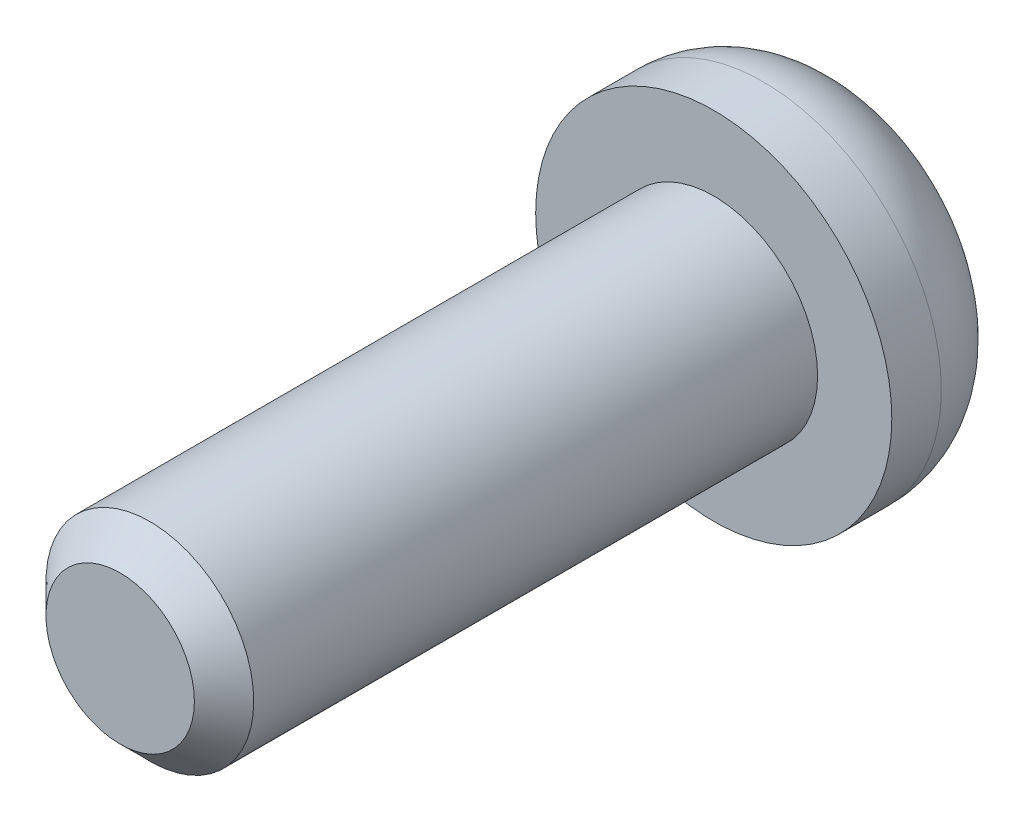
ISO-10303-21;
HEADER;
FILE_DESCRIPTION(('STEP AP214'),'2;1');
FILE_NAME('part.step','',(''),(''),'','','');
FILE_SCHEMA(('AUTOMOTIVE_DESIGN { 1 0 10303 214 1 1 1 1 }'));
ENDSEC;
DATA;
#1=APPLICATION_CONTEXT('core data for automotive mechanical design processes');
#2=APPLICATION_PROTOCOL_DEFINITION('international standard','automotive_design',2000,#1);
#3=PRODUCT_CONTEXT('',#1,'mechanical');
#4=PRODUCT('Part','Part','',(#3));
#5=PRODUCT_RELATED_PRODUCT_CATEGORY('part','',(#4));
#6=PRODUCT_DEFINITION_FORMATION('','',#4);
#7=PRODUCT_DEFINITION_CONTEXT('part definition',#1,'design');
#8=PRODUCT_DEFINITION('design','',#6,#7);
#9=PRODUCT_DEFINITION_SHAPE('','',#8);
#10=(LENGTH_UNIT() NAMED_UNIT(*) SI_UNIT(.MILLI.,.METRE.));
#11=(NAMED_UNIT(*) PLANE_ANGLE_UNIT() SI_UNIT($,.RADIAN.));
#12=(NAMED_UNIT(*) SI_UNIT($,.STERADIAN.) SOLID_ANGLE_UNIT());
#13=UNCERTAINTY_MEASURE_WITH_UNIT(LENGTH_MEASURE(1.E-05),#10,'distance_accuracy_value','');
#14=(GEOMETRIC_REPRESENTATION_CONTEXT(3) GLOBAL_UNCERTAINTY_ASSIGNED_CONTEXT((#13)) GLOBAL_UNIT_ASSIGNED_CONTEXT((#10,
#11,#12)) REPRESENTATION_CONTEXT('',''));
#15=CARTESIAN_POINT('',(0.,0.,0.));
#16=DIRECTION('',(0.,0.,1.));
#17=DIRECTION('',(1.,0.,0.));
#18=AXIS2_PLACEMENT_3D('',#15,#16,#17);
#19=CARTESIAN_POINT('',(0.,0.,0.));
#20=DIRECTION('',(0.,0.,1.));
#21=DIRECTION('',(1.,0.,0.));
#22=AXIS2_PLACEMENT_3D('',#19,#20,#21);
#23=PLANE('',#22);
#24=DIRECTION('',(0.,1.,0.));
#25=VECTOR('',#24,1.);
#26=CARTESIAN_POINT('',(-0.443511416600374,-0.411741974224887,0.));
#27=LINE('',#26,#25);
#28=CARTESIAN_POINT('',(-0.443511416600373,-0.783133209195683,0.));
#29=VERTEX_POINT('',#28);
#30=CARTESIAN_POINT('',(-0.443511416600374,-0.411741974224887,0.));
#31=VERTEX_POINT('',#30);
#32=EDGE_CURVE('E201',#29,#31,#27,.T.);
#33=ORIENTED_EDGE('',*,*,#32,.F.);
#34=CARTESIAN_POINT('',(0.,0.,0.));
#35=DIRECTION('',(0.,0.,1.));
#36=DIRECTION('',(1.,0.,0.));
#37=AXIS2_PLACEMENT_3D('',#34,#35,#36);
#38=CIRCLE('',#37,0.9);
#39=CARTESIAN_POINT('',(-0.800292788085331,-0.411741974224887,0.));
#40=VERTEX_POINT('',#39);
#41=EDGE_CURVE('E268',#29,#40,#38,.F.);
#42=ORIENTED_EDGE('',*,*,#41,.T.);
#43=DIRECTION('',(-1.,0.,0.));
#44=VECTOR('',#43,1.);
#45=CARTESIAN_POINT('',(-1.24419857549185,-0.411741974224887,0.));
#46=LINE('',#45,#44);
#47=EDGE_CURVE('E203',#31,#40,#46,.T.);
#48=ORIENTED_EDGE('',*,*,#47,.F.);
#49=EDGE_LOOP('',(#33,#42,#48));
#50=FACE_BOUND('',#49,.T.);
#51=ADVANCED_FACE('F35',(#50),#23,.F.);
#52=DIRECTION('',(1.,0.,0.));
#53=VECTOR('',#52,1.);
#54=CARTESIAN_POINT('',(-0.443511416600373,0.411741974224889,0.));
#55=LINE('',#54,#53);
#56=CARTESIAN_POINT('',(-0.800292788085329,0.411741974224889,0.));
#57=VERTEX_POINT('',#56);
#58=CARTESIAN_POINT('',(-0.443511416600373,0.411741974224889,0.));
#59=VERTEX_POINT('',#58);
#60=EDGE_CURVE('E207',#57,#59,#55,.T.);
#61=ORIENTED_EDGE('',*,*,#60,.F.);
#62=CARTESIAN_POINT('',(0.,0.,0.));
#63=DIRECTION('',(0.,0.,1.));
#64=DIRECTION('',(1.,0.,0.));
#65=AXIS2_PLACEMENT_3D('',#62,#63,#64);
#66=CIRCLE('',#65,0.9);
#67=CARTESIAN_POINT('',(-0.443511416600373,0.783133209195683,0.));
#68=VERTEX_POINT('',#67);
#69=EDGE_CURVE('E266',#57,#68,#66,.F.);
#70=ORIENTED_EDGE('',*,*,#69,.T.);
#71=DIRECTION('',(0.,1.,0.));
#72=VECTOR('',#71,1.);
#73=CARTESIAN_POINT('',(-0.443511416600373,0.411741974224889,0.));
#74=LINE('',#73,#72);
#75=EDGE_CURVE('E209',#59,#68,#74,.T.);
#76=ORIENTED_EDGE('',*,*,#75,.F.);
#77=EDGE_LOOP('',(#61,#70,#76));
#78=FACE_BOUND('',#77,.T.);
#79=ADVANCED_FACE('F390',(#78),#23,.F.);
#80=DIRECTION('',(0.,-1.,0.));
#81=VECTOR('',#80,1.);
#82=CARTESIAN_POINT('',(0.443511416600373,0.411741974224888,0.));
#83=LINE('',#82,#81);
#84=CARTESIAN_POINT('',(0.443511416600373,0.783133209195683,0.));
#85=VERTEX_POINT('',#84);
#86=CARTESIAN_POINT('',(0.443511416600373,0.411741974224888,0.));
#87=VERTEX_POINT('',#86);
#88=EDGE_CURVE('E212',#85,#87,#83,.T.);
#89=ORIENTED_EDGE('',*,*,#88,.F.);
#90=CARTESIAN_POINT('',(0.,0.,0.));
#91=DIRECTION('',(0.,0.,1.));
#92=DIRECTION('',(1.,0.,0.));
#93=AXIS2_PLACEMENT_3D('',#90,#91,#92);
#94=CIRCLE('',#93,0.9);
#95=CARTESIAN_POINT('',(0.80029278808533,0.411741974224888,0.));
#96=VERTEX_POINT('',#95);
#97=EDGE_CURVE('E264',#85,#96,#94,.F.);
#98=ORIENTED_EDGE('',*,*,#97,.T.);
#99=DIRECTION('',(1.,0.,0.));
#100=VECTOR('',#99,1.);
#101=CARTESIAN_POINT('',(0.443511416600373,0.411741974224888,0.));
#102=LINE('',#101,#100);
#103=EDGE_CURVE('E214',#87,#96,#102,.T.);
#104=ORIENTED_EDGE('',*,*,#103,.F.);
#105=EDGE_LOOP('',(#89,#98,#104));
#106=FACE_BOUND('',#105,.T.);
#107=ADVANCED_FACE('F413',(#106),#23,.F.);
#108=CARTESIAN_POINT('',(0.,0.,1.4));
#109=DIRECTION('',(0.,0.,1.));
#110=DIRECTION('',(1.,0.,0.));
#111=AXIS2_PLACEMENT_3D('',#108,#109,#110);
#112=PLANE('',#111);
#113=CARTESIAN_POINT('',(0.,0.,1.4));
#114=DIRECTION('',(0.,0.,1.));
#115=DIRECTION('',(1.,0.,0.));
#116=AXIS2_PLACEMENT_3D('',#113,#114,#115);
#117=CIRCLE('',#116,1.8);
#118=CARTESIAN_POINT('',(1.8,0.,1.4));
#119=VERTEX_POINT('',#118);
#120=EDGE_CURVE('E222',#119,#119,#117,.T.);
#121=ORIENTED_EDGE('',*,*,#120,.T.);
#122=EDGE_LOOP('',(#121));
#123=FACE_BOUND('',#122,.T.);
#124=CARTESIAN_POINT('',(0.,0.,1.4));
#125=DIRECTION('',(0.,0.,1.));
#126=DIRECTION('',(1.,0.,0.));
#127=AXIS2_PLACEMENT_3D('',#124,#125,#126);
#128=CIRCLE('',#127,1.05);
#129=CARTESIAN_POINT('',(1.05,0.,1.4));
#130=VERTEX_POINT('',#129);
#131=EDGE_CURVE('E204',#130,#130,#128,.T.);
#132=ORIENTED_EDGE('',*,*,#131,.F.);
#133=EDGE_LOOP('',(#132));
#134=FACE_BOUND('',#133,.T.);
#135=ADVANCED_FACE('F296',(#123,#134),#112,.T.);
#136=CARTESIAN_POINT('',(0.,0.,1.4));
#137=DIRECTION('',(0.,0.,-1.));
#138=DIRECTION('',(-1.,0.,0.));
#139=AXIS2_PLACEMENT_3D('',#136,#137,#138);
#140=CYLINDRICAL_SURFACE('',#139,1.8);
#141=CARTESIAN_POINT('',(0.,0.,0.9));
#142=DIRECTION('',(0.,0.,1.));
#143=DIRECTION('',(1.,0.,0.));
#144=AXIS2_PLACEMENT_3D('',#141,#142,#143);
#145=CIRCLE('',#144,1.8);
#146=CARTESIAN_POINT('',(1.8,0.,0.9));
#147=VERTEX_POINT('',#146);
#148=EDGE_CURVE('E259',#147,#147,#145,.T.);
#149=ORIENTED_EDGE('',*,*,#148,.T.);
#150=EDGE_LOOP('',(#149));
#151=FACE_BOUND('',#150,.T.);
#152=ORIENTED_EDGE('',*,*,#120,.F.);
#153=EDGE_LOOP('',(#152));
#154=FACE_BOUND('',#153,.T.);
#155=ADVANCED_FACE('F421',(#151,#154),#140,.T.);
#156=DIRECTION('',(-1.,0.,0.));
#157=VECTOR('',#156,1.);
#158=CARTESIAN_POINT('',(1.24419857549185,-0.411741974224888,0.));
#159=LINE('',#158,#157);
#160=CARTESIAN_POINT('',(0.80029278808533,-0.411741974224888,0.));
#161=VERTEX_POINT('',#160);
#162=CARTESIAN_POINT('',(0.443511416600374,-0.411741974224888,0.));
#163=VERTEX_POINT('',#162);
#164=EDGE_CURVE('E217',#161,#163,#159,.T.);
#165=ORIENTED_EDGE('',*,*,#164,.F.);
#166=CARTESIAN_POINT('',(0.,0.,0.));
#167=DIRECTION('',(0.,0.,1.));
#168=DIRECTION('',(1.,0.,0.));
#169=AXIS2_PLACEMENT_3D('',#166,#167,#168);
#170=CIRCLE('',#169,0.9);
#171=CARTESIAN_POINT('',(0.443511416600374,-0.783133209195683,0.));
#172=VERTEX_POINT('',#171);
#173=EDGE_CURVE('E262',#161,#172,#170,.F.);
#174=ORIENTED_EDGE('',*,*,#173,.T.);
#175=DIRECTION('',(0.,-1.,0.));
#176=VECTOR('',#175,1.);
#177=CARTESIAN_POINT('',(0.443511416600374,-0.411741974224888,0.));
#178=LINE('',#177,#176);
#179=EDGE_CURVE('E162',#163,#172,#178,.T.);
#180=ORIENTED_EDGE('',*,*,#179,.F.);
#181=EDGE_LOOP('',(#165,#174,#180));
#182=FACE_BOUND('',#181,.T.);
#183=ADVANCED_FACE('F318',(#182),#23,.F.);
#184=CARTESIAN_POINT('',(0.443511416600374,-0.411741974224888,0.8));
#185=DIRECTION('',(1.,0.,0.));
#186=DIRECTION('',(0.,0.,-1.));
#187=AXIS2_PLACEMENT_3D('',#184,#185,#186);
#188=PLANE('',#187);
#189=ORIENTED_EDGE('',*,*,#179,.T.);
#190=CARTESIAN_POINT('',(0.443511416600374,-0.783133209195683,0.));
#191=CARTESIAN_POINT('',(0.443511416600374,-0.814342862550393,-1.11953444354183E-05));
#192=CARTESIAN_POINT('',(0.443511416600374,-0.845566868505146,0.00122965153938987));
#193=CARTESIAN_POINT('',(0.443511416600374,-0.907829379965996,0.00634840445397137));
#194=CARTESIAN_POINT('',(0.443511416600374,-0.938867652150139,0.0102291211922806));
#195=CARTESIAN_POINT('',(0.443511416600374,-0.999564572231254,0.0206052145788294));
#196=CARTESIAN_POINT('',(0.443511416600374,-1.02923685533641,0.0270197526160871));
#197=CARTESIAN_POINT('',(0.443511416600374,-1.08786102440906,0.0424983307904848));
#198=CARTESIAN_POINT('',(0.443511416600374,-1.11681331261166,0.0515608537926696));
#199=CARTESIAN_POINT('',(0.443511416600374,-1.18831112854829,0.0776763751327097));
#200=CARTESIAN_POINT('',(0.443511416600374,-1.23024547757338,0.0964463078014975));
#201=CARTESIAN_POINT('',(0.443511416600374,-1.31187170471707,0.140360169288233));
#202=CARTESIAN_POINT('',(0.443511416600374,-1.35149020341271,0.165640267219651));
#203=CARTESIAN_POINT('',(0.443511416600374,-1.3889213019187,0.193869416797026));
#204=B_SPLINE_CURVE_WITH_KNOTS('',3,(#190,#191,#192,#193,#194,#195,#196,#197,#198,#199,#200,
#201,#202,#203),.UNSPECIFIED.,.F.,.F.,(4,2,2,2,2,2,4),(0.,0.0936249726246555,0.187349785455224,
0.278298875942525,0.36919595994654,0.506525956708021,0.647001999407291),.UNSPECIFIED.);
#205=CARTESIAN_POINT('',(0.443511416600374,-1.3889213019187,0.193869416797026));
#206=VERTEX_POINT('',#205);
#207=EDGE_CURVE('E62',#172,#206,#204,.T.);
#208=ORIENTED_EDGE('',*,*,#207,.T.);
#209=DIRECTION('',(0.,0.,-1.));
#210=VECTOR('',#209,1.);
#211=CARTESIAN_POINT('',(0.443511416600374,-1.3889213019187,0.8));
#212=LINE('',#211,#210);
#213=CARTESIAN_POINT('',(0.443511416600374,-1.3889213019187,0.8));
#214=VERTEX_POINT('',#213);
#215=EDGE_CURVE('E220',#214,#206,#212,.T.);
#216=ORIENTED_EDGE('',*,*,#215,.F.);
#217=DIRECTION('',(0.,-1.,0.));
#218=VECTOR('',#217,1.);
#219=CARTESIAN_POINT('',(0.443511416600374,-0.411741974224888,0.8));
#220=LINE('',#219,#218);
#221=CARTESIAN_POINT('',(0.443511416600374,-0.411741974224888,0.8));
#222=VERTEX_POINT('',#221);
#223=EDGE_CURVE('E161',#222,#214,#220,.T.);
#224=ORIENTED_EDGE('',*,*,#223,.F.);
#225=DIRECTION('',(0.,0.,-1.));
#226=VECTOR('',#225,1.);
#227=CARTESIAN_POINT('',(0.443511416600374,-0.411741974224888,0.8));
#228=LINE('',#227,#226);
#229=EDGE_CURVE('E223',#222,#163,#228,.T.);
#230=ORIENTED_EDGE('',*,*,#229,.T.);
#231=EDGE_LOOP('',(#189,#208,#216,#224,#230));
#232=FACE_BOUND('',#231,.T.);
#233=ADVANCED_FACE('F313',(#232),#188,.F.);
#234=CARTESIAN_POINT('',(1.24419857549185,-0.411741974224888,0.8));
#235=DIRECTION('',(0.,-1.,0.));
#236=DIRECTION('',(0.,0.,-1.));
#237=AXIS2_PLACEMENT_3D('',#234,#235,#236);
#238=PLANE('',#237);
#239=DIRECTION('',(0.,0.,-1.));
#240=VECTOR('',#239,1.);
#241=CARTESIAN_POINT('',(1.24419857549185,-0.411741974224888,0.8));
#242=LINE('',#241,#240);
#243=CARTESIAN_POINT('',(1.24419857549185,-0.411741974224888,0.8));
#244=VERTEX_POINT('',#243);
#245=CARTESIAN_POINT('',(1.24419857549185,-0.411741974224888,0.0990990354246962));
#246=VERTEX_POINT('',#245);
#247=EDGE_CURVE('E226',#244,#246,#242,.T.);
#248=ORIENTED_EDGE('',*,*,#247,.T.);
#249=CARTESIAN_POINT('',(1.24419857549185,-0.411741974224888,0.0990990354246962));
#250=CARTESIAN_POINT('',(1.21737747291785,-0.411741974224888,0.0860389011906389));
#251=CARTESIAN_POINT('',(1.18993712527349,-0.411741974224888,0.074266694220715));
#252=CARTESIAN_POINT('',(1.13408854399268,-0.411741974224888,0.0533199457270093));
#253=CARTESIAN_POINT('',(1.10568054385476,-0.411741974224888,0.0441447824315274));
#254=CARTESIAN_POINT('',(1.04869242781944,-0.411741974224888,0.0285549067971542));
#255=CARTESIAN_POINT('',(1.02012548169563,-0.411741974224888,0.0220917487931853));
#256=CARTESIAN_POINT('',(0.96255325101828,-0.411741974224888,0.0116504369941824));
#257=CARTESIAN_POINT('',(0.933548160442289,-0.411741974224888,0.00767121471757885));
#258=CARTESIAN_POINT('',(0.887178542146528,-0.411741974224888,0.00325081951131676));
#259=CARTESIAN_POINT('',(0.869883947164444,-0.411741974224888,0.00202874060872294));
#260=CARTESIAN_POINT('',(0.835157553190892,-0.411741974224888,0.000400613882708351));
#261=CARTESIAN_POINT('',(0.817725533385838,-0.411741974224888,-7.51914070027549E-07));
#262=CARTESIAN_POINT('',(0.80029278808533,-0.411741974224888,0.));
#263=B_SPLINE_CURVE_WITH_KNOTS('',3,(#249,#250,#251,#252,#253,#254,#255,#256,#257,#258,#259,
#260,#261,#262),.UNSPECIFIED.,.F.,.F.,(4,2,2,2,2,2,4),(0.,0.0894518203012783,0.178882206328569,
0.266638997489949,0.354358013420314,0.406353581887812,0.458644957754757),.UNSPECIFIED.);
#264=EDGE_CURVE('E307',#246,#161,#263,.T.);
#265=ORIENTED_EDGE('',*,*,#264,.T.);
#266=ORIENTED_EDGE('',*,*,#164,.T.);
#267=ORIENTED_EDGE('',*,*,#229,.F.);
#268=DIRECTION('',(-1.,0.,0.));
#269=VECTOR('',#268,1.);
#270=CARTESIAN_POINT('',(1.24419857549185,-0.411741974224888,0.8));
#271=LINE('',#270,#269);
#272=EDGE_CURVE('E198',#244,#222,#271,.T.);
#273=ORIENTED_EDGE('',*,*,#272,.F.);
#274=EDGE_LOOP('',(#248,#265,#266,#267,#273));
#275=FACE_BOUND('',#274,.T.);
#276=ADVANCED_FACE('F317',(#275),#238,.F.);
#277=CARTESIAN_POINT('',(1.24419857549185,0.411741974224888,0.8));
#278=DIRECTION('',(1.,0.,0.));
#279=DIRECTION('',(0.,0.,-1.));
#280=AXIS2_PLACEMENT_3D('',#277,#278,#279);
#281=PLANE('',#280);
#282=DIRECTION('',(0.,0.,-1.));
#283=VECTOR('',#282,1.);
#284=CARTESIAN_POINT('',(1.24419857549185,0.411741974224888,0.8));
#285=LINE('',#284,#283);
#286=CARTESIAN_POINT('',(1.24419857549185,0.411741974224888,0.8));
#287=VERTEX_POINT('',#286);
#288=CARTESIAN_POINT('',(1.24419857549185,0.411741974224888,0.0990990354246962));
#289=VERTEX_POINT('',#288);
#290=EDGE_CURVE('E229',#287,#289,#285,.T.);
#291=ORIENTED_EDGE('',*,*,#290,.T.);
#292=CARTESIAN_POINT('',(1.24419857549185,0.411741974224888,0.0990990354246962));
#293=CARTESIAN_POINT('',(1.24419857549185,0.377627086391099,0.0936150021505368));
#294=CARTESIAN_POINT('',(1.24419857549185,0.343385820195588,0.0889777449673483));
#295=CARTESIAN_POINT('',(1.24419857549185,0.274746276138216,0.0812152955889615));
#296=CARTESIAN_POINT('',(1.24419857549185,0.240348074526226,0.0780894346692015));
#297=CARTESIAN_POINT('',(1.24419857549185,0.171648419454841,0.0731772272462588));
#298=CARTESIAN_POINT('',(1.24419857549185,0.13734746572373,0.0713836484561653));
#299=CARTESIAN_POINT('',(1.24419857549185,0.068697679899091,0.0690043051959882));
#300=CARTESIAN_POINT('',(1.24419857549185,0.0343488399495491,0.068418770184804));
#301=CARTESIAN_POINT('',(1.24419857549185,-0.0343488399495339,0.0684187701848041));
#302=CARTESIAN_POINT('',(1.24419857549185,-0.068697679899075,0.0690043051959884));
#303=CARTESIAN_POINT('',(1.24419857549185,-0.137347465723713,0.0713836484561639));
#304=CARTESIAN_POINT('',(1.24419857549185,-0.171648419454823,0.0731772272462557));
#305=CARTESIAN_POINT('',(1.24419857549185,-0.240348074526206,0.0780894346692022));
#306=CARTESIAN_POINT('',(1.24419857549185,-0.274746276138194,0.0812152955889676));
#307=CARTESIAN_POINT('',(1.24419857549185,-0.343385820195566,0.0889777449673372));
#308=CARTESIAN_POINT('',(1.24419857549185,-0.377627086391079,0.0936150021505029));
#309=CARTESIAN_POINT('',(1.24419857549185,-0.411741974224874,0.0990990354246077));
#310=B_SPLINE_CURVE_WITH_KNOTS('',3,(#292,#293,#294,#295,#296,#297,#298,#299,#300,#301,#302,
#303,#304,#305,#306,#307,#308,#309),.UNSPECIFIED.,.F.,.F.,(4,2,2,2,2,2,2,2,4),(0.,
0.103633977336179,0.207222059264348,0.310243619802076,0.41328474671545,0.516325873628821,
0.619347434166547,0.722935516094713,0.826569493430888),.UNSPECIFIED.);
#311=EDGE_CURVE('E332',#289,#246,#310,.T.);
#312=ORIENTED_EDGE('',*,*,#311,.T.);
#313=ORIENTED_EDGE('',*,*,#247,.F.);
#314=DIRECTION('',(0.,-1.,0.));
#315=VECTOR('',#314,1.);
#316=CARTESIAN_POINT('',(1.24419857549185,0.411741974224888,0.8));
#317=LINE('',#316,#315);
#318=EDGE_CURVE('E195',#287,#244,#317,.T.);
#319=ORIENTED_EDGE('',*,*,#318,.F.);
#320=EDGE_LOOP('',(#291,#312,#313,#319));
#321=FACE_BOUND('',#320,.T.);
#322=ADVANCED_FACE('F323',(#321),#281,.F.);
#323=CARTESIAN_POINT('',(0.443511416600373,0.411741974224888,0.8));
#324=DIRECTION('',(0.,1.,0.));
#325=DIRECTION('',(0.,0.,1.));
#326=AXIS2_PLACEMENT_3D('',#323,#324,#325);
#327=PLANE('',#326);
#328=ORIENTED_EDGE('',*,*,#103,.T.);
#329=CARTESIAN_POINT('',(0.80029278808533,0.411741974224888,0.));
#330=CARTESIAN_POINT('',(0.830417492102532,0.411741974224888,-9.79195888945773E-06));
#331=CARTESIAN_POINT('',(0.860554315540854,0.411741974224888,0.00119612832769569));
#332=CARTESIAN_POINT('',(0.92065924215107,0.411741974224888,0.00614105277511874));
#333=CARTESIAN_POINT('',(0.950627058582926,0.411741974224888,0.00988351522262327));
#334=CARTESIAN_POINT('',(1.00951003360639,0.411741974224888,0.0199004261112247));
#335=CARTESIAN_POINT('',(1.03843419164136,0.411741974224888,0.0261216115458075));
#336=CARTESIAN_POINT('',(1.09558775049772,0.411741974224888,0.0411215659175507));
#337=CARTESIAN_POINT('',(1.12381779902692,0.411741974224888,0.0498978440888533));
#338=CARTESIAN_POINT('',(1.16730054104716,0.411741974224888,0.0656391945542513));
#339=CARTESIAN_POINT('',(1.18287124025871,0.411741974224888,0.0717388440841686));
#340=CARTESIAN_POINT('',(1.2137603861971,0.411741974224888,0.0847866331372671));
#341=CARTESIAN_POINT('',(1.22907682247716,0.411741974224888,0.0917395309824494));
#342=CARTESIAN_POINT('',(1.24419857549185,0.411741974224888,0.0990990354246945));
#343=B_SPLINE_CURVE_WITH_KNOTS('',3,(#329,#330,#331,#332,#333,#334,#335,#336,#337,#338,#339,
#340,#341,#342),.UNSPECIFIED.,.F.,.F.,(4,2,2,2,2,2,4),(0.,0.0903679044039569,0.18085926366384,
0.269502811814765,0.358060235795485,0.40820782217457,0.458648991393895),.UNSPECIFIED.);
#344=EDGE_CURVE('E337',#96,#289,#343,.T.);
#345=ORIENTED_EDGE('',*,*,#344,.T.);
#346=ORIENTED_EDGE('',*,*,#290,.F.);
#347=DIRECTION('',(1.,0.,0.));
#348=VECTOR('',#347,1.);
#349=CARTESIAN_POINT('',(0.443511416600373,0.411741974224888,0.8));
#350=LINE('',#349,#348);
#351=CARTESIAN_POINT('',(0.443511416600373,0.411741974224888,0.8));
#352=VERTEX_POINT('',#351);
#353=EDGE_CURVE('E192',#352,#287,#350,.T.);
#354=ORIENTED_EDGE('',*,*,#353,.F.);
#355=DIRECTION('',(0.,0.,-1.));
#356=VECTOR('',#355,1.);
#357=CARTESIAN_POINT('',(0.443511416600373,0.411741974224888,0.8));
#358=LINE('',#357,#356);
#359=EDGE_CURVE('E232',#352,#87,#358,.T.);
#360=ORIENTED_EDGE('',*,*,#359,.T.);
#361=EDGE_LOOP('',(#328,#345,#346,#354,#360));
#362=FACE_BOUND('',#361,.T.);
#363=ADVANCED_FACE('F328',(#362),#327,.F.);
#364=CARTESIAN_POINT('',(0.443511416600373,0.411741974224888,0.8));
#365=DIRECTION('',(1.,0.,0.));
#366=DIRECTION('',(0.,0.,-1.));
#367=AXIS2_PLACEMENT_3D('',#364,#365,#366);
#368=PLANE('',#367);
#369=DIRECTION('',(0.,0.,-1.));
#370=VECTOR('',#369,1.);
#371=CARTESIAN_POINT('',(0.443511416600373,1.3889213019187,0.8));
#372=LINE('',#371,#370);
#373=CARTESIAN_POINT('',(0.443511416600373,1.3889213019187,0.8));
#374=VERTEX_POINT('',#373);
#375=CARTESIAN_POINT('',(0.443511416600373,1.3889213019187,0.193869416797026));
#376=VERTEX_POINT('',#375);
#377=EDGE_CURVE('E235',#374,#376,#372,.T.);
#378=ORIENTED_EDGE('',*,*,#377,.T.);
#379=CARTESIAN_POINT('',(0.443511416600373,1.3889213019187,0.193869416797026));
#380=CARTESIAN_POINT('',(0.443511416600373,1.36705126678958,0.177404121040755));
#381=CARTESIAN_POINT('',(0.443511416600373,1.34445423813642,0.161929480366324));
#382=CARTESIAN_POINT('',(0.443511416600373,1.29799429392394,0.133035113954576));
#383=CARTESIAN_POINT('',(0.443511416600373,1.27413188239935,0.119614578170606));
#384=CARTESIAN_POINT('',(0.443511416600373,1.20219383287739,0.0831805284172477));
#385=CARTESIAN_POINT('',(0.443511416600373,1.15258958808266,0.0631190967845743));
#386=CARTESIAN_POINT('',(0.443511416600373,1.05093397579095,0.0313126149959952));
#387=CARTESIAN_POINT('',(0.443511416600373,0.998888055282011,0.0195499123450635));
#388=CARTESIAN_POINT('',(0.443511416600373,0.919290939929102,0.00777416457308125));
#389=CARTESIAN_POINT('',(0.443511416600373,0.892136804660587,0.00482898798026552));
#390=CARTESIAN_POINT('',(0.443511416600373,0.837700122807062,0.000940449954619502));
#391=CARTESIAN_POINT('',(0.443511416600373,0.810417660250066,-4.0767216789097E-06));
#392=CARTESIAN_POINT('',(0.443511416600373,0.783133209195683,0.));
#393=B_SPLINE_CURVE_WITH_KNOTS('',3,(#379,#380,#381,#382,#383,#384,#385,#386,#387,#388,#389,
#390,#391,#392),.UNSPECIFIED.,.F.,.F.,(4,2,2,2,2,2,4),(0.,0.0820703385974684,0.16410822848711,
0.323841056226241,0.483233078234303,0.565108946012554,0.646937113499569),.UNSPECIFIED.);
#394=EDGE_CURVE('E342',#376,#85,#393,.T.);
#395=ORIENTED_EDGE('',*,*,#394,.T.);
#396=ORIENTED_EDGE('',*,*,#88,.T.);
#397=ORIENTED_EDGE('',*,*,#359,.F.);
#398=DIRECTION('',(0.,-1.,0.));
#399=VECTOR('',#398,1.);
#400=CARTESIAN_POINT('',(0.443511416600373,0.411741974224888,0.8));
#401=LINE('',#400,#399);
#402=EDGE_CURVE('E189',#374,#352,#401,.T.);
#403=ORIENTED_EDGE('',*,*,#402,.F.);
#404=EDGE_LOOP('',(#378,#395,#396,#397,#403));
#405=FACE_BOUND('',#404,.T.);
#406=ADVANCED_FACE('F353',(#405),#368,.F.);
#407=CARTESIAN_POINT('',(0.443511416600373,1.3889213019187,0.8));
#408=DIRECTION('',(0.,1.,0.));
#409=DIRECTION('',(0.,0.,1.));
#410=AXIS2_PLACEMENT_3D('',#407,#408,#409);
#411=PLANE('',#410);
#412=DIRECTION('',(0.,0.,-1.));
#413=VECTOR('',#412,1.);
#414=CARTESIAN_POINT('',(-0.443511416600373,1.3889213019187,0.8));
#415=LINE('',#414,#413);
#416=CARTESIAN_POINT('',(-0.443511416600373,1.3889213019187,0.8));
#417=VERTEX_POINT('',#416);
#418=CARTESIAN_POINT('',(-0.443511416600373,1.3889213019187,0.193869416797026));
#419=VERTEX_POINT('',#418);
#420=EDGE_CURVE('E238',#417,#419,#415,.T.);
#421=ORIENTED_EDGE('',*,*,#420,.T.);
#422=CARTESIAN_POINT('',(-0.443511416600373,1.3889213019187,0.193869416797026));
#423=CARTESIAN_POINT('',(-0.41763258176455,1.3889213019187,0.187651408310202));
#424=CARTESIAN_POINT('',(-0.391602481545724,1.3889213019187,0.182098867402728));
#425=CARTESIAN_POINT('',(-0.339317995686822,1.3889213019187,0.172228797117188));
#426=CARTESIAN_POINT('',(-0.313063693954163,1.3889213019187,0.167910824912499));
#427=CARTESIAN_POINT('',(-0.234067004627873,1.3889213019187,0.156660946445162));
#428=CARTESIAN_POINT('',(-0.181077692558752,1.3889213019187,0.151430036768481));
#429=CARTESIAN_POINT('',(-0.0758056537726061,1.3889213019187,0.145072712159207));
#430=CARTESIAN_POINT('',(-0.0235268689449334,1.3889213019187,0.14387580103711));
#431=CARTESIAN_POINT('',(0.0809732950561807,1.3889213019187,0.14527611539976));
#432=CARTESIAN_POINT('',(0.13319468444777,1.3889213019187,0.147872493018585));
#433=CARTESIAN_POINT('',(0.228544927195414,1.3889213019187,0.156322545146885));
#434=CARTESIAN_POINT('',(0.27172765200401,1.3889213019187,0.161555822026529));
#435=CARTESIAN_POINT('',(0.3579089749041,1.3889213019187,0.175210540938804));
#436=CARTESIAN_POINT('',(0.400903845103025,1.3889213019187,0.18365529134658));
#437=CARTESIAN_POINT('',(0.443511416600373,1.3889213019187,0.193869416797025));
#438=B_SPLINE_CURVE_WITH_KNOTS('',3,(#422,#423,#424,#425,#426,#427,#428,#429,#430,#431,#432,
#433,#434,#435,#436,#437),.UNSPECIFIED.,.F.,.F.,(4,2,2,2,2,2,2,4),(0.,0.0798237152105168,
0.159618762482719,0.319168540018379,0.475915230445632,0.632626890624568,0.763015105855631,
0.894368299811651),.UNSPECIFIED.);
#439=EDGE_CURVE('E347',#419,#376,#438,.T.);
#440=ORIENTED_EDGE('',*,*,#439,.T.);
#441=ORIENTED_EDGE('',*,*,#377,.F.);
#442=DIRECTION('',(1.,0.,0.));
#443=VECTOR('',#442,1.);
#444=CARTESIAN_POINT('',(-0.443511416600373,1.3889213019187,0.8));
#445=LINE('',#444,#443);
#446=EDGE_CURVE('E187',#417,#374,#445,.T.);
#447=ORIENTED_EDGE('',*,*,#446,.F.);
#448=EDGE_LOOP('',(#421,#440,#441,#447));
#449=FACE_BOUND('',#448,.T.);
#450=ADVANCED_FACE('F356',(#449),#411,.F.);
#451=CARTESIAN_POINT('',(-0.443511416600373,0.411741974224889,0.8));
#452=DIRECTION('',(-1.,0.,0.));
#453=DIRECTION('',(0.,0.,1.));
#454=AXIS2_PLACEMENT_3D('',#451,#452,#453);
#455=PLANE('',#454);
#456=ORIENTED_EDGE('',*,*,#75,.T.);
#457=CARTESIAN_POINT('',(-0.443511416600373,0.783133209195683,0.));
#458=CARTESIAN_POINT('',(-0.443511416600373,0.814342862550394,-1.11953444352979E-05));
#459=CARTESIAN_POINT('',(-0.443511416600373,0.845566868505146,0.00122965153938999));
#460=CARTESIAN_POINT('',(-0.443511416600373,0.907829379965996,0.00634840445397142));
#461=CARTESIAN_POINT('',(-0.443511416600373,0.938867652150139,0.0102291211922806));
#462=CARTESIAN_POINT('',(-0.443511416600373,0.999564572231255,0.0206052145788294));
#463=CARTESIAN_POINT('',(-0.443511416600373,1.02923685533641,0.0270197526160871));
#464=CARTESIAN_POINT('',(-0.443511416600373,1.08786102440906,0.0424983307904849));
#465=CARTESIAN_POINT('',(-0.443511416600373,1.11681331261166,0.0515608537926696));
#466=CARTESIAN_POINT('',(-0.443511416600373,1.18831112854829,0.0776763751327096));
#467=CARTESIAN_POINT('',(-0.443511416600373,1.23024547757338,0.0964463078014975));
#468=CARTESIAN_POINT('',(-0.443511416600373,1.31187170471707,0.140360169288233));
#469=CARTESIAN_POINT('',(-0.443511416600373,1.35149020341271,0.165640267219651));
#470=CARTESIAN_POINT('',(-0.443511416600373,1.3889213019187,0.193869416797026));
#471=B_SPLINE_CURVE_WITH_KNOTS('',3,(#457,#458,#459,#460,#461,#462,#463,#464,#465,#466,#467,
#468,#469,#470),.UNSPECIFIED.,.F.,.F.,(4,2,2,2,2,2,4),(0.,0.0936249726246553,0.187349785455224,
0.278298875942525,0.36919595994654,0.506525956708021,0.64700199940729),.UNSPECIFIED.);
#472=EDGE_CURVE('E368',#68,#419,#471,.T.);
#473=ORIENTED_EDGE('',*,*,#472,.T.);
#474=ORIENTED_EDGE('',*,*,#420,.F.);
#475=DIRECTION('',(0.,1.,0.));
#476=VECTOR('',#475,1.);
#477=CARTESIAN_POINT('',(-0.443511416600373,0.411741974224889,0.8));
#478=LINE('',#477,#476);
#479=CARTESIAN_POINT('',(-0.443511416600373,0.411741974224889,0.8));
#480=VERTEX_POINT('',#479);
#481=EDGE_CURVE('E184',#480,#417,#478,.T.);
#482=ORIENTED_EDGE('',*,*,#481,.F.);
#483=DIRECTION('',(0.,0.,-1.));
#484=VECTOR('',#483,1.);
#485=CARTESIAN_POINT('',(-0.443511416600373,0.411741974224889,0.8));
#486=LINE('',#485,#484);
#487=EDGE_CURVE('E241',#480,#59,#486,.T.);
#488=ORIENTED_EDGE('',*,*,#487,.T.);
#489=EDGE_LOOP('',(#456,#473,#474,#482,#488));
#490=FACE_BOUND('',#489,.T.);
#491=ADVANCED_FACE('F361',(#490),#455,.F.);
#492=CARTESIAN_POINT('',(-0.443511416600373,0.411741974224889,0.8));
#493=DIRECTION('',(0.,1.,0.));
#494=DIRECTION('',(0.,0.,1.));
#495=AXIS2_PLACEMENT_3D('',#492,#493,#494);
#496=PLANE('',#495);
#497=DIRECTION('',(0.,0.,-1.));
#498=VECTOR('',#497,1.);
#499=CARTESIAN_POINT('',(-1.24419857549185,0.411741974224889,0.8));
#500=LINE('',#499,#498);
#501=CARTESIAN_POINT('',(-1.24419857549185,0.411741974224889,0.8));
#502=VERTEX_POINT('',#501);
#503=CARTESIAN_POINT('',(-1.24419857549185,0.411741974224889,0.0990990354246963));
#504=VERTEX_POINT('',#503);
#505=EDGE_CURVE('E244',#502,#504,#500,.T.);
#506=ORIENTED_EDGE('',*,*,#505,.T.);
#507=CARTESIAN_POINT('',(-1.24419857549185,0.411741974224889,0.0990990354246963));
#508=CARTESIAN_POINT('',(-1.21737747291785,0.411741974224889,0.0860389011906389));
#509=CARTESIAN_POINT('',(-1.18993712527349,0.411741974224889,0.074266694220715));
#510=CARTESIAN_POINT('',(-1.13408854399268,0.411741974224889,0.0533199457270093));
#511=CARTESIAN_POINT('',(-1.10568054385476,0.411741974224889,0.0441447824315276));
#512=CARTESIAN_POINT('',(-1.04869242781944,0.411741974224889,0.0285549067971545));
#513=CARTESIAN_POINT('',(-1.02012548169563,0.411741974224889,0.0220917487931854));
#514=CARTESIAN_POINT('',(-0.96255325101828,0.411741974224889,0.0116504369941825));
#515=CARTESIAN_POINT('',(-0.933548160442289,0.411741974224889,0.00767121471757889));
#516=CARTESIAN_POINT('',(-0.887178542146528,0.411741974224889,0.00325081951131677));
#517=CARTESIAN_POINT('',(-0.869883947164444,0.411741974224889,0.00202874060872293));
#518=CARTESIAN_POINT('',(-0.835157553190891,0.411741974224889,0.000400613882708325));
#519=CARTESIAN_POINT('',(-0.817725533385838,0.411741974224889,-7.51914070063614E-07));
#520=CARTESIAN_POINT('',(-0.800292788085329,0.411741974224889,0.));
#521=B_SPLINE_CURVE_WITH_KNOTS('',3,(#507,#508,#509,#510,#511,#512,#513,#514,#515,#516,#517,
#518,#519,#520),.UNSPECIFIED.,.F.,.F.,(4,2,2,2,2,2,4),(0.,0.0894518203012785,0.178882206328569,
0.266638997489949,0.354358013420314,0.406353581887812,0.458644957754757),.UNSPECIFIED.);
#522=EDGE_CURVE('E372',#504,#57,#521,.T.);
#523=ORIENTED_EDGE('',*,*,#522,.T.);
#524=ORIENTED_EDGE('',*,*,#60,.T.);
#525=ORIENTED_EDGE('',*,*,#487,.F.);
#526=DIRECTION('',(1.,0.,0.));
#527=VECTOR('',#526,1.);
#528=CARTESIAN_POINT('',(-0.443511416600373,0.411741974224889,0.8));
#529=LINE('',#528,#527);
#530=EDGE_CURVE('E181',#502,#480,#529,.T.);
#531=ORIENTED_EDGE('',*,*,#530,.F.);
#532=EDGE_LOOP('',(#506,#523,#524,#525,#531));
#533=FACE_BOUND('',#532,.T.);
#534=ADVANCED_FACE('F365',(#533),#496,.F.);
#535=CARTESIAN_POINT('',(-1.24419857549185,0.411741974224889,0.8));
#536=DIRECTION('',(-1.,0.,0.));
#537=DIRECTION('',(0.,0.,1.));
#538=AXIS2_PLACEMENT_3D('',#535,#536,#537);
#539=PLANE('',#538);
#540=DIRECTION('',(0.,0.,-1.));
#541=VECTOR('',#540,1.);
#542=CARTESIAN_POINT('',(-1.24419857549185,-0.411741974224887,0.8));
#543=LINE('',#542,#541);
#544=CARTESIAN_POINT('',(-1.24419857549185,-0.411741974224887,0.8));
#545=VERTEX_POINT('',#544);
#546=CARTESIAN_POINT('',(-1.24419857549185,-0.411741974224887,0.0990990354246959));
#547=VERTEX_POINT('',#546);
#548=EDGE_CURVE('E247',#545,#547,#543,.T.);
#549=ORIENTED_EDGE('',*,*,#548,.T.);
#550=CARTESIAN_POINT('',(-1.24419857549185,-0.411741974224887,0.0990990354246959));
#551=CARTESIAN_POINT('',(-1.24419857549185,-0.377627086391098,0.0936150021505365));
#552=CARTESIAN_POINT('',(-1.24419857549185,-0.343385820195586,0.0889777449673481));
#553=CARTESIAN_POINT('',(-1.24419857549185,-0.274746276138214,0.0812152955889614));
#554=CARTESIAN_POINT('',(-1.24419857549185,-0.240348074526225,0.0780894346692014));
#555=CARTESIAN_POINT('',(-1.24419857549185,-0.171648419454839,0.0731772272462588));
#556=CARTESIAN_POINT('',(-1.24419857549185,-0.137347465723729,0.0713836484561653));
#557=CARTESIAN_POINT('',(-1.24419857549185,-0.0686976798990897,0.0690043051959882));
#558=CARTESIAN_POINT('',(-1.24419857549185,-0.0343488399495478,0.068418770184804));
#559=CARTESIAN_POINT('',(-1.24419857549185,0.0343488399495351,0.0684187701848041));
#560=CARTESIAN_POINT('',(-1.24419857549185,0.0686976798990761,0.0690043051959884));
#561=CARTESIAN_POINT('',(-1.24419857549185,0.137347465723714,0.071383648456164));
#562=CARTESIAN_POINT('',(-1.24419857549185,0.171648419454824,0.0731772272462558));
#563=CARTESIAN_POINT('',(-1.24419857549185,0.240348074526207,0.0780894346692023));
#564=CARTESIAN_POINT('',(-1.24419857549185,0.274746276138195,0.0812152955889677));
#565=CARTESIAN_POINT('',(-1.24419857549185,0.343385820195567,0.0889777449673373));
#566=CARTESIAN_POINT('',(-1.24419857549185,0.37762708639108,0.093615002150503));
#567=CARTESIAN_POINT('',(-1.24419857549185,0.411741974224875,0.0990990354246079));
#568=B_SPLINE_CURVE_WITH_KNOTS('',3,(#550,#551,#552,#553,#554,#555,#556,#557,#558,#559,#560,
#561,#562,#563,#564,#565,#566,#567),.UNSPECIFIED.,.F.,.F.,(4,2,2,2,2,2,2,2,4),(0.,
0.103633977336178,0.207222059264347,0.310243619802075,0.413284746715449,0.516325873628821,
0.619347434166546,0.722935516094712,0.826569493430887),.UNSPECIFIED.);
#569=EDGE_CURVE('E277',#547,#504,#568,.T.);
#570=ORIENTED_EDGE('',*,*,#569,.T.);
#571=ORIENTED_EDGE('',*,*,#505,.F.);
#572=DIRECTION('',(0.,1.,0.));
#573=VECTOR('',#572,1.);
#574=CARTESIAN_POINT('',(-1.24419857549185,0.411741974224889,0.8));
#575=LINE('',#574,#573);
#576=EDGE_CURVE('E175',#545,#502,#575,.T.);
#577=ORIENTED_EDGE('',*,*,#576,.F.);
#578=EDGE_LOOP('',(#549,#570,#571,#577));
#579=FACE_BOUND('',#578,.T.);
#580=ADVANCED_FACE('F286',(#579),#539,.F.);
#581=CARTESIAN_POINT('',(-1.24419857549185,-0.411741974224887,0.8));
#582=DIRECTION('',(0.,-1.,0.));
#583=DIRECTION('',(0.,0.,-1.));
#584=AXIS2_PLACEMENT_3D('',#581,#582,#583);
#585=PLANE('',#584);
#586=ORIENTED_EDGE('',*,*,#47,.T.);
#587=CARTESIAN_POINT('',(-0.800292788085331,-0.411741974224887,0.));
#588=CARTESIAN_POINT('',(-0.830417492102533,-0.411741974224887,-9.79195888946189E-06));
#589=CARTESIAN_POINT('',(-0.860554315540855,-0.411741974224887,0.00119612832769566));
#590=CARTESIAN_POINT('',(-0.92065924215107,-0.411741974224887,0.00614105277511864));
#591=CARTESIAN_POINT('',(-0.950627058582926,-0.411741974224887,0.00988351522262313));
#592=CARTESIAN_POINT('',(-1.00951003360639,-0.411741974224887,0.0199004261112245));
#593=CARTESIAN_POINT('',(-1.03843419164136,-0.411741974224887,0.0261216115458073));
#594=CARTESIAN_POINT('',(-1.09558775049772,-0.411741974224887,0.0411215659175507));
#595=CARTESIAN_POINT('',(-1.12381779902692,-0.411741974224887,0.0498978440888532));
#596=CARTESIAN_POINT('',(-1.16730054104716,-0.411741974224887,0.0656391945542511));
#597=CARTESIAN_POINT('',(-1.18287124025871,-0.411741974224887,0.0717388440841683));
#598=CARTESIAN_POINT('',(-1.2137603861971,-0.411741974224887,0.0847866331372667));
#599=CARTESIAN_POINT('',(-1.22907682247716,-0.411741974224887,0.091739530982449));
#600=CARTESIAN_POINT('',(-1.24419857549185,-0.411741974224887,0.0990990354246944));
#601=B_SPLINE_CURVE_WITH_KNOTS('',3,(#587,#588,#589,#590,#591,#592,#593,#594,#595,#596,#597,
#598,#599,#600),.UNSPECIFIED.,.F.,.F.,(4,2,2,2,2,2,4),(0.,0.0903679044039567,0.18085926366384,
0.269502811814765,0.358060235795484,0.408207822174569,0.458648991393894),.UNSPECIFIED.);
#602=EDGE_CURVE('E271',#40,#547,#601,.T.);
#603=ORIENTED_EDGE('',*,*,#602,.T.);
#604=ORIENTED_EDGE('',*,*,#548,.F.);
#605=DIRECTION('',(-1.,0.,0.));
#606=VECTOR('',#605,1.);
#607=CARTESIAN_POINT('',(-1.24419857549185,-0.411741974224887,0.8));
#608=LINE('',#607,#606);
#609=CARTESIAN_POINT('',(-0.443511416600374,-0.411741974224887,0.8));
#610=VERTEX_POINT('',#609);
#611=EDGE_CURVE('E173',#610,#545,#608,.T.);
#612=ORIENTED_EDGE('',*,*,#611,.F.);
#613=DIRECTION('',(0.,0.,-1.));
#614=VECTOR('',#613,1.);
#615=CARTESIAN_POINT('',(-0.443511416600374,-0.411741974224887,0.8));
#616=LINE('',#615,#614);
#617=EDGE_CURVE('E168',#610,#31,#616,.T.);
#618=ORIENTED_EDGE('',*,*,#617,.T.);
#619=EDGE_LOOP('',(#586,#603,#604,#612,#618));
#620=FACE_BOUND('',#619,.T.);
#621=ADVANCED_FACE('F283',(#620),#585,.F.);
#622=CARTESIAN_POINT('',(-0.443511416600374,-0.411741974224887,0.8));
#623=DIRECTION('',(-1.,0.,0.));
#624=DIRECTION('',(0.,-1.,0.));
#625=AXIS2_PLACEMENT_3D('',#622,#623,#624);
#626=PLANE('',#625);
#627=DIRECTION('',(0.,0.,-1.));
#628=VECTOR('',#627,1.);
#629=CARTESIAN_POINT('',(-0.443511416600371,-1.3889213019187,0.8));
#630=LINE('',#629,#628);
#631=CARTESIAN_POINT('',(-0.443511416600371,-1.3889213019187,0.8));
#632=VERTEX_POINT('',#631);
#633=CARTESIAN_POINT('',(-0.443511416600371,-1.3889213019187,0.193869416797025));
#634=VERTEX_POINT('',#633);
#635=EDGE_CURVE('E164',#632,#634,#630,.T.);
#636=ORIENTED_EDGE('',*,*,#635,.T.);
#637=CARTESIAN_POINT('',(-0.443511416600371,-1.3889213019187,0.193869416797025));
#638=CARTESIAN_POINT('',(-0.443511416600371,-1.36705126678958,0.177404121040755));
#639=CARTESIAN_POINT('',(-0.443511416600371,-1.34445423813642,0.161929480366324));
#640=CARTESIAN_POINT('',(-0.443511416600371,-1.29799429392394,0.133035113954575));
#641=CARTESIAN_POINT('',(-0.443511416600371,-1.27413188239935,0.119614578170605));
#642=CARTESIAN_POINT('',(-0.443511416600372,-1.20219383287739,0.0831805284172475));
#643=CARTESIAN_POINT('',(-0.443511416600372,-1.15258958808266,0.0631190967845742));
#644=CARTESIAN_POINT('',(-0.443511416600372,-1.05093397579095,0.0313126149959951));
#645=CARTESIAN_POINT('',(-0.443511416600372,-0.998888055282011,0.0195499123450632));
#646=CARTESIAN_POINT('',(-0.443511416600372,-0.919290939929102,0.00777416457308119));
#647=CARTESIAN_POINT('',(-0.443511416600372,-0.892136804660587,0.00482898798026557));
#648=CARTESIAN_POINT('',(-0.443511416600373,-0.837700122807062,0.000940449954619654));
#649=CARTESIAN_POINT('',(-0.443511416600373,-0.810417660250066,-4.07672167876048E-06));
#650=CARTESIAN_POINT('',(-0.443511416600373,-0.783133209195683,0.));
#651=B_SPLINE_CURVE_WITH_KNOTS('',3,(#637,#638,#639,#640,#641,#642,#643,#644,#645,#646,#647,
#648,#649,#650),.UNSPECIFIED.,.F.,.F.,(4,2,2,2,2,2,4),(0.,0.0820703385974683,0.16410822848711,
0.323841056226241,0.483233078234303,0.565108946012554,0.646937113499569),.UNSPECIFIED.);
#652=EDGE_CURVE('E11',#634,#29,#651,.T.);
#653=ORIENTED_EDGE('',*,*,#652,.T.);
#654=ORIENTED_EDGE('',*,*,#32,.T.);
#655=ORIENTED_EDGE('',*,*,#617,.F.);
#656=DIRECTION('',(0.,1.,0.));
#657=VECTOR('',#656,1.);
#658=CARTESIAN_POINT('',(-0.443511416600374,-0.411741974224887,0.8));
#659=LINE('',#658,#657);
#660=EDGE_CURVE('E158',#632,#610,#659,.T.);
#661=ORIENTED_EDGE('',*,*,#660,.F.);
#662=EDGE_LOOP('',(#636,#653,#654,#655,#661));
#663=FACE_BOUND('',#662,.T.);
#664=ADVANCED_FACE('F170',(#663),#626,.F.);
#665=CARTESIAN_POINT('',(-0.443511416600371,-1.3889213019187,0.8));
#666=DIRECTION('',(0.,-1.,0.));
#667=DIRECTION('',(0.,0.,-1.));
#668=AXIS2_PLACEMENT_3D('',#665,#666,#667);
#669=PLANE('',#668);
#670=ORIENTED_EDGE('',*,*,#215,.T.);
#671=CARTESIAN_POINT('',(0.443511416600374,-1.3889213019187,0.193869416797026));
#672=CARTESIAN_POINT('',(0.417632581764551,-1.3889213019187,0.187651408310202));
#673=CARTESIAN_POINT('',(0.391602481545725,-1.3889213019187,0.182098867402728));
#674=CARTESIAN_POINT('',(0.339317995686822,-1.3889213019187,0.172228797117189));
#675=CARTESIAN_POINT('',(0.313063693954164,-1.3889213019187,0.167910824912499));
#676=CARTESIAN_POINT('',(0.234067004627874,-1.3889213019187,0.156660946445162));
#677=CARTESIAN_POINT('',(0.181077692558753,-1.3889213019187,0.151430036768481));
#678=CARTESIAN_POINT('',(0.0758056537726075,-1.3889213019187,0.145072712159207));
#679=CARTESIAN_POINT('',(0.0235268689449348,-1.3889213019187,0.14387580103711));
#680=CARTESIAN_POINT('',(-0.0809732950561792,-1.3889213019187,0.145276115399761));
#681=CARTESIAN_POINT('',(-0.133194684447769,-1.3889213019187,0.147872493018585));
#682=CARTESIAN_POINT('',(-0.228544927195413,-1.3889213019187,0.156322545146884));
#683=CARTESIAN_POINT('',(-0.271727652004008,-1.3889213019187,0.161555822026529));
#684=CARTESIAN_POINT('',(-0.357908974904098,-1.3889213019187,0.175210540938804));
#685=CARTESIAN_POINT('',(-0.400903845103023,-1.3889213019187,0.183655291346579));
#686=CARTESIAN_POINT('',(-0.443511416600371,-1.3889213019187,0.193869416797025));
#687=B_SPLINE_CURVE_WITH_KNOTS('',3,(#671,#672,#673,#674,#675,#676,#677,#678,#679,#680,#681,
#682,#683,#684,#685,#686),.UNSPECIFIED.,.F.,.F.,(4,2,2,2,2,2,2,4),(0.,0.0798237152105167,
0.159618762482719,0.319168540018379,0.475915230445632,0.632626890624567,0.76301510585563,
0.89436829981165),.UNSPECIFIED.);
#688=EDGE_CURVE('E48',#206,#634,#687,.T.);
#689=ORIENTED_EDGE('',*,*,#688,.T.);
#690=ORIENTED_EDGE('',*,*,#635,.F.);
#691=DIRECTION('',(-1.,0.,0.));
#692=VECTOR('',#691,1.);
#693=CARTESIAN_POINT('',(0.443511416600374,-1.3889213019187,0.8));
#694=LINE('',#693,#692);
#695=EDGE_CURVE('E154',#214,#632,#694,.T.);
#696=ORIENTED_EDGE('',*,*,#695,.F.);
#697=EDGE_LOOP('',(#670,#689,#690,#696));
#698=FACE_BOUND('',#697,.T.);
#699=ADVANCED_FACE('F165',(#698),#669,.F.);
#700=CARTESIAN_POINT('',(0.,0.,0.8));
#701=DIRECTION('',(0.,0.,1.));
#702=DIRECTION('',(1.,0.,0.));
#703=AXIS2_PLACEMENT_3D('',#700,#701,#702);
#704=PLANE('',#703);
#705=ORIENTED_EDGE('',*,*,#695,.T.);
#706=ORIENTED_EDGE('',*,*,#660,.T.);
#707=ORIENTED_EDGE('',*,*,#611,.T.);
#708=ORIENTED_EDGE('',*,*,#576,.T.);
#709=ORIENTED_EDGE('',*,*,#530,.T.);
#710=ORIENTED_EDGE('',*,*,#481,.T.);
#711=ORIENTED_EDGE('',*,*,#446,.T.);
#712=ORIENTED_EDGE('',*,*,#402,.T.);
#713=ORIENTED_EDGE('',*,*,#353,.T.);
#714=ORIENTED_EDGE('',*,*,#318,.T.);
#715=ORIENTED_EDGE('',*,*,#272,.T.);
#716=ORIENTED_EDGE('',*,*,#223,.T.);
#717=EDGE_LOOP('',(#705,#706,#707,#708,#709,#710,#711,#712,#713,#714,#715,#716));
#718=FACE_BOUND('',#717,.T.);
#719=ADVANCED_FACE('F155',(#718),#704,.F.);
#720=CARTESIAN_POINT('',(0.,0.,7.4));
#721=DIRECTION('',(0.,0.,-1.));
#722=DIRECTION('',(-1.,0.,0.));
#723=AXIS2_PLACEMENT_3D('',#720,#721,#722);
#724=CYLINDRICAL_SURFACE('',#723,1.05);
#725=CARTESIAN_POINT('',(0.,0.,7.1));
#726=DIRECTION('',(0.,0.,1.));
#727=DIRECTION('',(1.,0.,0.));
#728=AXIS2_PLACEMENT_3D('',#725,#726,#727);
#729=CIRCLE('',#728,1.05);
#730=CARTESIAN_POINT('',(1.05,0.,7.1));
#731=VERTEX_POINT('',#730);
#732=EDGE_CURVE('E256',#731,#731,#729,.F.);
#733=ORIENTED_EDGE('',*,*,#732,.T.);
#734=EDGE_LOOP('',(#733));
#735=FACE_BOUND('',#734,.T.);
#736=ORIENTED_EDGE('',*,*,#131,.T.);
#737=EDGE_LOOP('',(#736));
#738=FACE_BOUND('',#737,.T.);
#739=ADVANCED_FACE('F552',(#735,#738),#724,.T.);
#740=CARTESIAN_POINT('',(0.,0.,7.4));
#741=DIRECTION('',(0.,0.,1.));
#742=DIRECTION('',(1.,0.,0.));
#743=AXIS2_PLACEMENT_3D('',#740,#741,#742);
#744=PLANE('',#743);
#745=CARTESIAN_POINT('',(0.,0.,7.4));
#746=DIRECTION('',(0.,0.,1.));
#747=DIRECTION('',(1.,0.,0.));
#748=AXIS2_PLACEMENT_3D('',#745,#746,#747);
#749=CIRCLE('',#748,0.750000000000002);
#750=CARTESIAN_POINT('',(0.750000000000002,0.,7.4));
#751=VERTEX_POINT('',#750);
#752=EDGE_CURVE('E253',#751,#751,#749,.T.);
#753=ORIENTED_EDGE('',*,*,#752,.T.);
#754=EDGE_LOOP('',(#753));
#755=FACE_BOUND('',#754,.T.);
#756=ADVANCED_FACE('F546',(#755),#744,.T.);
#757=CARTESIAN_POINT('',(0.,0.,7.4));
#758=DIRECTION('',(0.,0.,-1.));
#759=DIRECTION('',(-1.,0.,0.));
#760=AXIS2_PLACEMENT_3D('',#757,#758,#759);
#761=CONICAL_SURFACE('',#760,0.750000000000002,0.785398163397445);
#762=ORIENTED_EDGE('',*,*,#732,.F.);
#763=EDGE_LOOP('',(#762));
#764=FACE_BOUND('',#763,.T.);
#765=ORIENTED_EDGE('',*,*,#752,.F.);
#766=EDGE_LOOP('',(#765));
#767=FACE_BOUND('',#766,.T.);
#768=ADVANCED_FACE('F539',(#764,#767),#761,.T.);
#769=CARTESIAN_POINT('',(0.,0.,0.9));
#770=DIRECTION('',(0.,0.,1.));
#771=DIRECTION('',(1.,0.,0.));
#772=AXIS2_PLACEMENT_3D('',#769,#770,#771);
#773=DEGENERATE_TOROIDAL_SURFACE('',#772,0.9,0.9,.T.);
#774=ORIENTED_EDGE('',*,*,#602,.F.);
#775=ORIENTED_EDGE('',*,*,#41,.F.);
#776=ORIENTED_EDGE('',*,*,#652,.F.);
#777=ORIENTED_EDGE('',*,*,#688,.F.);
#778=ORIENTED_EDGE('',*,*,#207,.F.);
#779=ORIENTED_EDGE('',*,*,#173,.F.);
#780=ORIENTED_EDGE('',*,*,#264,.F.);
#781=ORIENTED_EDGE('',*,*,#311,.F.);
#782=ORIENTED_EDGE('',*,*,#344,.F.);
#783=ORIENTED_EDGE('',*,*,#97,.F.);
#784=ORIENTED_EDGE('',*,*,#394,.F.);
#785=ORIENTED_EDGE('',*,*,#439,.F.);
#786=ORIENTED_EDGE('',*,*,#472,.F.);
#787=ORIENTED_EDGE('',*,*,#69,.F.);
#788=ORIENTED_EDGE('',*,*,#522,.F.);
#789=ORIENTED_EDGE('',*,*,#569,.F.);
#790=EDGE_LOOP('',(#774,#775,#776,#777,#778,#779,#780,#781,#782,#783,#784,#785,#786,#787,#788,#789));
#791=FACE_BOUND('',#790,.T.);
#792=ORIENTED_EDGE('',*,*,#148,.F.);
#793=EDGE_LOOP('',(#792));
#794=FACE_BOUND('',#793,.T.);
#795=ADVANCED_FACE('F37',(#791,#794),#773,.T.);
#796=CLOSED_SHELL('',(#51,#79,#107,#135,#155,#183,#233,#276,#322,#363,#406,#450,#491,#534,#580,
#621,#664,#699,#719,#739,#756,#768,#795));
#797=MANIFOLD_SOLID_BREP('B2',#796);
#798=ADVANCED_BREP_SHAPE_REPRESENTATION('',(#18,#797),#14);
#799=SHAPE_DEFINITION_REPRESENTATION(#9,#798);
ENDSEC;
END-ISO-10303-21;
